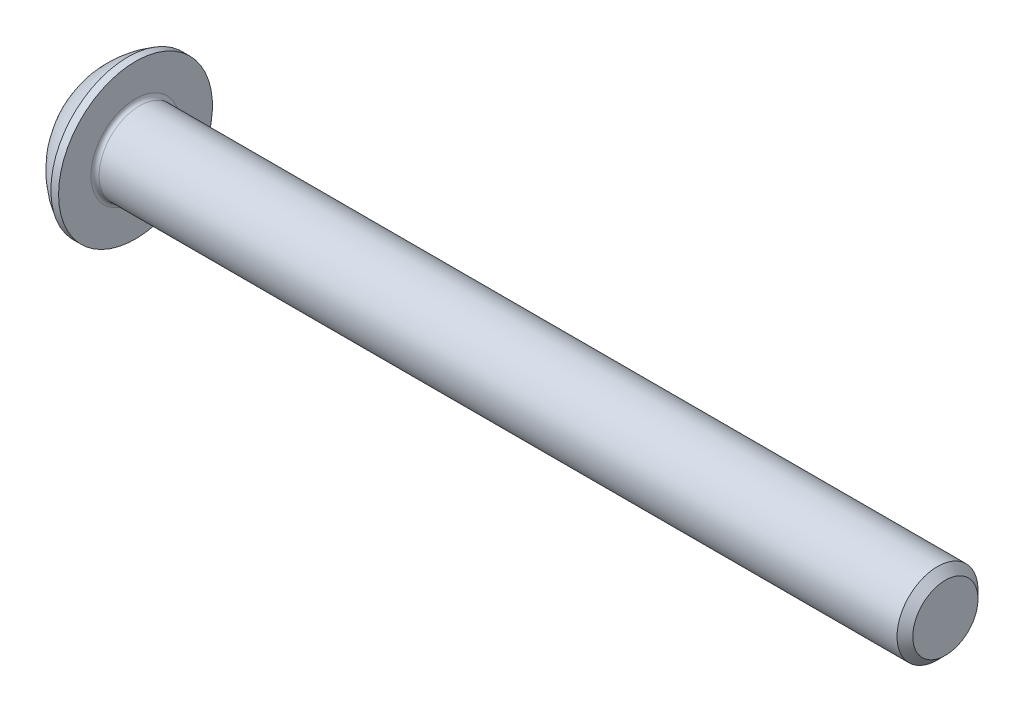
ISO-10303-21;
HEADER;
FILE_DESCRIPTION(('STEP AP214'),'2;1');
FILE_NAME('part.step','',(''),(''),'','','');
FILE_SCHEMA(('AUTOMOTIVE_DESIGN { 1 0 10303 214 1 1 1 1 }'));
ENDSEC;
DATA;
#1=APPLICATION_CONTEXT('core data for automotive mechanical design processes');
#2=APPLICATION_PROTOCOL_DEFINITION('international standard','automotive_design',2000,#1);
#3=PRODUCT_CONTEXT('',#1,'mechanical');
#4=PRODUCT('Part','Part','',(#3));
#5=PRODUCT_RELATED_PRODUCT_CATEGORY('part','',(#4));
#6=PRODUCT_DEFINITION_FORMATION('','',#4);
#7=PRODUCT_DEFINITION_CONTEXT('part definition',#1,'design');
#8=PRODUCT_DEFINITION('design','',#6,#7);
#9=PRODUCT_DEFINITION_SHAPE('','',#8);
#10=(LENGTH_UNIT() NAMED_UNIT(*) SI_UNIT(.MILLI.,.METRE.));
#11=(NAMED_UNIT(*) PLANE_ANGLE_UNIT() SI_UNIT($,.RADIAN.));
#12=(NAMED_UNIT(*) SI_UNIT($,.STERADIAN.) SOLID_ANGLE_UNIT());
#13=UNCERTAINTY_MEASURE_WITH_UNIT(LENGTH_MEASURE(1.E-05),#10,'distance_accuracy_value','');
#14=(GEOMETRIC_REPRESENTATION_CONTEXT(3) GLOBAL_UNCERTAINTY_ASSIGNED_CONTEXT((#13)) GLOBAL_UNIT_ASSIGNED_CONTEXT((#10,
#11,#12)) REPRESENTATION_CONTEXT('',''));
#15=CARTESIAN_POINT('',(0.,0.,0.));
#16=DIRECTION('',(0.,0.,1.));
#17=DIRECTION('',(1.,0.,0.));
#18=AXIS2_PLACEMENT_3D('',#15,#16,#17);
#19=CARTESIAN_POINT('',(0.,0.,0.));
#20=DIRECTION('',(-1.,0.,0.));
#21=DIRECTION('',(0.,0.,1.));
#22=AXIS2_PLACEMENT_3D('',#19,#20,#21);
#23=PLANE('',#22);
#24=CARTESIAN_POINT('',(0.,0.,0.));
#25=DIRECTION('',(-1.,0.,0.));
#26=DIRECTION('',(0.,0.,1.));
#27=AXIS2_PLACEMENT_3D('',#24,#25,#26);
#28=CIRCLE('',#27,1.9);
#29=CARTESIAN_POINT('',(0.,1.9,0.));
#30=VERTEX_POINT('',#29);
#31=EDGE_CURVE('E153',#30,#30,#28,.T.);
#32=ORIENTED_EDGE('',*,*,#31,.T.);
#33=EDGE_LOOP('',(#32));
#34=FACE_BOUND('',#33,.T.);
#35=DIRECTION('',(0.,-1.,0.));
#36=VECTOR('',#35,1.);
#37=CARTESIAN_POINT('',(0.,-0.721687836487031,1.25));
#38=LINE('',#37,#36);
#39=CARTESIAN_POINT('',(0.,0.721687836487033,1.25));
#40=VERTEX_POINT('',#39);
#41=CARTESIAN_POINT('',(0.,-0.721687836487031,1.25));
#42=VERTEX_POINT('',#41);
#43=EDGE_CURVE('E48',#40,#42,#38,.T.);
#44=ORIENTED_EDGE('',*,*,#43,.T.);
#45=DIRECTION('',(0.,-0.5,-0.866025403784438));
#46=VECTOR('',#45,1.);
#47=CARTESIAN_POINT('',(0.,-1.44337567297406,0.));
#48=LINE('',#47,#46);
#49=CARTESIAN_POINT('',(0.,-1.44337567297406,0.));
#50=VERTEX_POINT('',#49);
#51=EDGE_CURVE('E273',#42,#50,#48,.T.);
#52=ORIENTED_EDGE('',*,*,#51,.T.);
#53=DIRECTION('',(0.,0.5,-0.866025403784438));
#54=VECTOR('',#53,1.);
#55=CARTESIAN_POINT('',(0.,-0.721687836487032,-1.25));
#56=LINE('',#55,#54);
#57=CARTESIAN_POINT('',(0.,-0.721687836487032,-1.25));
#58=VERTEX_POINT('',#57);
#59=EDGE_CURVE('E128',#50,#58,#56,.T.);
#60=ORIENTED_EDGE('',*,*,#59,.T.);
#61=DIRECTION('',(0.,1.,0.));
#62=VECTOR('',#61,1.);
#63=CARTESIAN_POINT('',(0.,0.721687836487033,-1.25));
#64=LINE('',#63,#62);
#65=CARTESIAN_POINT('',(0.,0.721687836487033,-1.25));
#66=VERTEX_POINT('',#65);
#67=EDGE_CURVE('E276',#58,#66,#64,.T.);
#68=ORIENTED_EDGE('',*,*,#67,.T.);
#69=DIRECTION('',(0.,0.5,0.866025403784439));
#70=VECTOR('',#69,1.);
#71=CARTESIAN_POINT('',(0.,1.44337567297406,0.));
#72=LINE('',#71,#70);
#73=CARTESIAN_POINT('',(0.,1.44337567297406,0.));
#74=VERTEX_POINT('',#73);
#75=EDGE_CURVE('E278',#66,#74,#72,.T.);
#76=ORIENTED_EDGE('',*,*,#75,.T.);
#77=DIRECTION('',(0.,-0.5,0.866025403784439));
#78=VECTOR('',#77,1.);
#79=CARTESIAN_POINT('',(0.,0.721687836487033,1.25));
#80=LINE('',#79,#78);
#81=EDGE_CURVE('E280',#74,#40,#80,.T.);
#82=ORIENTED_EDGE('',*,*,#81,.T.);
#83=EDGE_LOOP('',(#44,#52,#60,#68,#76,#82));
#84=FACE_BOUND('',#83,.T.);
#85=ADVANCED_FACE('F33',(#34,#84),#23,.T.);
#86=CARTESIAN_POINT('',(3.88527472527473,0.,0.));
#87=DIRECTION('',(-1.,0.,0.));
#88=DIRECTION('',(0.,1.,0.));
#89=AXIS2_PLACEMENT_3D('',#86,#87,#88);
#90=SPHERICAL_SURFACE('',#89,4.3249693283142);
#91=CARTESIAN_POINT('',(1.82,0.,0.));
#92=DIRECTION('',(-1.,0.,0.));
#93=DIRECTION('',(0.,0.,1.));
#94=AXIS2_PLACEMENT_3D('',#91,#92,#93);
#95=CIRCLE('',#94,3.8);
#96=CARTESIAN_POINT('',(1.82,3.8,0.));
#97=VERTEX_POINT('',#96);
#98=EDGE_CURVE('E150',#97,#97,#95,.T.);
#99=CARTESIAN_POINT('',(1.82,3.8,0.));
#100=CARTESIAN_POINT('',(1.79553223778235,3.78670197498787,0.));
#101=CARTESIAN_POINT('',(1.77119294730718,3.77316757105695,0.));
#102=CARTESIAN_POINT('',(1.72278031308152,3.74563119292022,0.));
#103=CARTESIAN_POINT('',(1.69870696933103,3.73162921871441,0.));
#104=CARTESIAN_POINT('',(1.65083523179446,3.7031628875906,0.));
#105=CARTESIAN_POINT('',(1.62703683800837,3.6886985306726,0.));
#106=CARTESIAN_POINT('',(1.57972387446203,3.65931284095831,0.));
#107=CARTESIAN_POINT('',(1.55620930470177,3.64439150816201,0.));
#108=CARTESIAN_POINT('',(1.50947276449225,3.61409743150663,0.));
#109=CARTESIAN_POINT('',(1.48625079404298,3.59872468764754,0.));
#110=CARTESIAN_POINT('',(1.44010811665664,3.56753352546924,0.));
#111=CARTESIAN_POINT('',(1.41718740971957,3.55171510715004,0.));
#112=CARTESIAN_POINT('',(1.37165581166264,3.51963849804541,0.));
#113=CARTESIAN_POINT('',(1.34904492054277,3.50338030725998,0.));
#114=CARTESIAN_POINT('',(1.30414139068938,3.47043021954608,0.));
#115=CARTESIAN_POINT('',(1.28184875195586,3.45373832261761,0.));
#116=CARTESIAN_POINT('',(1.23759004473439,3.41992705070111,0.));
#117=CARTESIAN_POINT('',(1.21562397624644,3.40280767571308,0.));
#118=CARTESIAN_POINT('',(1.17202660551528,3.3681478352793,0.));
#119=CARTESIAN_POINT('',(1.15039530327208,3.35060736983354,0.));
#120=CARTESIAN_POINT('',(1.10747553612391,3.31511189319918,0.));
#121=CARTESIAN_POINT('',(1.08618707121895,3.29715688201057,0.));
#122=CARTESIAN_POINT('',(1.04396092192025,3.26083901328234,0.));
#123=CARTESIAN_POINT('',(1.02302323752651,3.24247615574272,0.));
#124=CARTESIAN_POINT('',(0.981506461539865,3.20534944588,0.));
#125=CARTESIAN_POINT('',(0.960927369946952,3.18658559355691,0.));
#126=CARTESIAN_POINT('',(0.920135458052999,3.14866389531445,0.));
#127=CARTESIAN_POINT('',(0.899922637751959,3.12950604939509,0.));
#128=CARTESIAN_POINT('',(0.859870810269304,3.09080351215454,0.));
#129=CARTESIAN_POINT('',(0.840031803087689,3.07125882083336,0.));
#130=CARTESIAN_POINT('',(0.800735004193913,3.0317898853238,0.));
#131=CARTESIAN_POINT('',(0.781277212481752,3.01186564113541,0.));
#132=CARTESIAN_POINT('',(0.74275010463742,2.97164503404517,0.));
#133=CARTESIAN_POINT('',(0.723680788505248,2.95134867114332,0.));
#134=CARTESIAN_POINT('',(0.685937746983035,2.91039139962521,0.));
#135=CARTESIAN_POINT('',(0.667264021592993,2.88973049100894,0.));
#136=CARTESIAN_POINT('',(0.630319129113973,2.84805183708071,0.));
#137=CARTESIAN_POINT('',(0.612047962024995,2.82703409176873,0.));
#138=CARTESIAN_POINT('',(0.575915003504076,2.78464960661105,0.));
#139=CARTESIAN_POINT('',(0.558053212072135,2.76328286676534,0.));
#140=CARTESIAN_POINT('',(0.522745669474638,2.72020836491933,0.));
#141=CARTESIAN_POINT('',(0.505299918309082,2.69850060291903,0.));
#142=CARTESIAN_POINT('',(0.470830965620254,2.65475215638556,0.));
#143=CARTESIAN_POINT('',(0.453807764096982,2.63271147185239,0.));
#144=CARTESIAN_POINT('',(0.420190262406822,2.58830540409509,0.));
#145=CARTESIAN_POINT('',(0.403595962239933,2.56594002087097,0.));
#146=CARTESIAN_POINT('',(0.370842454943266,2.52089290072626,0.));
#147=CARTESIAN_POINT('',(0.354683247813488,2.49821116380567,0.));
#148=CARTESIAN_POINT('',(0.322805955934171,2.45253979929826,0.));
#149=CARTESIAN_POINT('',(0.307087871184631,2.42955017171145,0.));
#150=CARTESIAN_POINT('',(0.27609868879919,2.38327160379141,0.));
#151=CARTESIAN_POINT('',(0.260827591163289,2.35998266345817,0.));
#152=CARTESIAN_POINT('',(0.230738081024335,2.31311415961106,0.));
#153=CARTESIAN_POINT('',(0.215919668521283,2.28953459609717,0.));
#154=CARTESIAN_POINT('',(0.186741057514276,2.24209364401867,0.));
#155=CARTESIAN_POINT('',(0.172380859010321,2.21823225545407,0.));
#156=CARTESIAN_POINT('',(0.144124034818958,2.17023655608655,0.));
#157=CARTESIAN_POINT('',(0.130227409131549,2.14610224528364,0.));
#158=CARTESIAN_POINT('',(0.102902912986767,2.09756970784785,0.));
#159=CARTESIAN_POINT('',(0.0894750425293921,2.07317148121498,0.));
#160=CARTESIAN_POINT('',(0.0630930771761369,2.02412021042083,0.));
#161=CARTESIAN_POINT('',(0.0501389822802563,1.99946716625955,0.));
#162=CARTESIAN_POINT('',(0.0247093637594986,1.94991547834234,0.));
#163=CARTESIAN_POINT('',(0.0122338401346214,1.9250168345864,0.));
#164=CARTESIAN_POINT('',(0.,1.9,0.));
#165=B_SPLINE_CURVE_WITH_KNOTS('',3,(#99,#100,#101,#102,#103,#104,#105,#106,#107,#108,#109,#110,
#111,#112,#113,#114,#115,#116,#117,#118,#119,#120,#121,#122,#123,#124,#125,#126,#127,#128,#129,
#130,#131,#132,#133,#134,#135,#136,#137,#138,#139,#140,#141,#142,#143,#144,#145,#146,#147,#148,
#149,#150,#151,#152,#153,#154,#155,#156,#157,#158,#159,#160,#161,#162,#163,#164),.UNSPECIFIED.,
.F.,.F.,(4,2,2,2,2,2,2,2,2,2,2,2,2,2,2,2,2,2,2,2,2,2,2,2,2,2,2,2,2,2,2,2,4),(0.,
0.083542578086179,0.167085156172358,0.250627734258538,0.334170312344717,0.417712890430896,
0.501255468517075,0.584798046603254,0.668340624689434,0.751883202775613,0.835425780861792,
0.918968358947971,1.00251093703415,1.08605351512033,1.16959609320651,1.25313867129269,
1.33668124937887,1.42022382746505,1.50376640555123,1.5873089836374,1.67085156172358,
1.75439413980976,1.83793671789594,1.92147929598212,2.0050218740683,2.08856445215448,
2.17210703024066,2.25564960832684,2.33919218641302,2.4227347644992,2.50627734258538,
2.58981992067156,2.67336249875773),.UNSPECIFIED.);
#166=EDGE_CURVE('BSEAM174',#97,#30,#165,.T.);
#167=ORIENTED_EDGE('',*,*,#98,.T.);
#168=ORIENTED_EDGE('',*,*,#31,.F.);
#169=ORIENTED_EDGE('',*,*,#166,.T.);
#170=ORIENTED_EDGE('',*,*,#166,.F.);
#171=EDGE_LOOP('',(#167,#169,#168,#170));
#172=FACE_BOUND('',#171,.T.);
#173=ADVANCED_FACE('F174',(#172),#90,.T.);
#174=CARTESIAN_POINT('',(0.,0.,0.));
#175=DIRECTION('',(-1.,0.,0.));
#176=DIRECTION('',(0.,0.,1.));
#177=AXIS2_PLACEMENT_3D('',#174,#175,#176);
#178=CYLINDRICAL_SURFACE('',#177,3.8);
#179=ORIENTED_EDGE('',*,*,#98,.F.);
#180=EDGE_LOOP('',(#179));
#181=FACE_BOUND('',#180,.T.);
#182=CARTESIAN_POINT('',(2.2,0.,0.));
#183=DIRECTION('',(-1.,0.,0.));
#184=DIRECTION('',(0.,0.,1.));
#185=AXIS2_PLACEMENT_3D('',#182,#183,#184);
#186=CIRCLE('',#185,3.8);
#187=CARTESIAN_POINT('',(2.2,0.,3.8));
#188=VERTEX_POINT('',#187);
#189=EDGE_CURVE('E147',#188,#188,#186,.T.);
#190=ORIENTED_EDGE('',*,*,#189,.T.);
#191=EDGE_LOOP('',(#190));
#192=FACE_BOUND('',#191,.T.);
#193=ADVANCED_FACE('F179',(#181,#192),#178,.T.);
#194=CARTESIAN_POINT('',(2.2,2.,0.));
#195=DIRECTION('',(-1.,0.,0.));
#196=DIRECTION('',(0.,0.,1.));
#197=AXIS2_PLACEMENT_3D('',#194,#195,#196);
#198=PLANE('',#197);
#199=CARTESIAN_POINT('',(2.2,0.,0.));
#200=DIRECTION('',(-1.,0.,0.));
#201=DIRECTION('',(0.,0.,1.));
#202=AXIS2_PLACEMENT_3D('',#199,#200,#201);
#203=CIRCLE('',#202,2.2);
#204=CARTESIAN_POINT('',(2.2,0.,2.2));
#205=VERTEX_POINT('',#204);
#206=EDGE_CURVE('E41',#205,#205,#203,.T.);
#207=ORIENTED_EDGE('',*,*,#206,.T.);
#208=EDGE_LOOP('',(#207));
#209=FACE_BOUND('',#208,.T.);
#210=ORIENTED_EDGE('',*,*,#189,.F.);
#211=EDGE_LOOP('',(#210));
#212=FACE_BOUND('',#211,.T.);
#213=ADVANCED_FACE('F158',(#209,#212),#198,.F.);
#214=CARTESIAN_POINT('',(0.,0.,0.));
#215=DIRECTION('',(-1.,0.,0.));
#216=DIRECTION('',(0.,0.,1.));
#217=AXIS2_PLACEMENT_3D('',#214,#215,#216);
#218=CYLINDRICAL_SURFACE('',#217,2.);
#219=CARTESIAN_POINT('',(2.4,0.,0.));
#220=DIRECTION('',(-1.,0.,0.));
#221=DIRECTION('',(0.,0.,1.));
#222=AXIS2_PLACEMENT_3D('',#219,#220,#221);
#223=CIRCLE('',#222,2.);
#224=CARTESIAN_POINT('',(2.4,0.,2.));
#225=VERTEX_POINT('',#224);
#226=EDGE_CURVE('E11',#225,#225,#223,.F.);
#227=ORIENTED_EDGE('',*,*,#226,.T.);
#228=EDGE_LOOP('',(#227));
#229=FACE_BOUND('',#228,.T.);
#230=CARTESIAN_POINT('',(41.81,0.,0.));
#231=DIRECTION('',(-1.,0.,0.));
#232=DIRECTION('',(0.,0.,1.));
#233=AXIS2_PLACEMENT_3D('',#230,#231,#232);
#234=CIRCLE('',#233,2.);
#235=CARTESIAN_POINT('',(41.81,0.,2.));
#236=VERTEX_POINT('',#235);
#237=EDGE_CURVE('E144',#236,#236,#234,.T.);
#238=ORIENTED_EDGE('',*,*,#237,.T.);
#239=EDGE_LOOP('',(#238));
#240=FACE_BOUND('',#239,.T.);
#241=ADVANCED_FACE('F188',(#229,#240),#218,.T.);
#242=CARTESIAN_POINT('',(42.2,0.,0.));
#243=DIRECTION('',(-1.,0.,0.));
#244=DIRECTION('',(0.,0.,1.));
#245=AXIS2_PLACEMENT_3D('',#242,#243,#244);
#246=CONICAL_SURFACE('',#245,1.61,0.785398163397433);
#247=ORIENTED_EDGE('',*,*,#237,.F.);
#248=EDGE_LOOP('',(#247));
#249=FACE_BOUND('',#248,.T.);
#250=CARTESIAN_POINT('',(42.2,0.,0.));
#251=DIRECTION('',(-1.,0.,0.));
#252=DIRECTION('',(0.,0.,1.));
#253=AXIS2_PLACEMENT_3D('',#250,#251,#252);
#254=CIRCLE('',#253,1.61);
#255=CARTESIAN_POINT('',(42.2,0.,1.61));
#256=VERTEX_POINT('',#255);
#257=EDGE_CURVE('E140',#256,#256,#254,.T.);
#258=ORIENTED_EDGE('',*,*,#257,.T.);
#259=EDGE_LOOP('',(#258));
#260=FACE_BOUND('',#259,.T.);
#261=ADVANCED_FACE('F169',(#249,#260),#246,.T.);
#262=CARTESIAN_POINT('',(42.2,0.,0.));
#263=DIRECTION('',(-1.,0.,0.));
#264=DIRECTION('',(0.,0.,1.));
#265=AXIS2_PLACEMENT_3D('',#262,#263,#264);
#266=PLANE('',#265);
#267=ORIENTED_EDGE('',*,*,#257,.F.);
#268=EDGE_LOOP('',(#267));
#269=FACE_BOUND('',#268,.T.);
#270=ADVANCED_FACE('F162',(#269),#266,.F.);
#271=CARTESIAN_POINT('',(2.4,0.,0.));
#272=DIRECTION('',(-1.,0.,0.));
#273=DIRECTION('',(0.,0.,1.));
#274=AXIS2_PLACEMENT_3D('',#271,#272,#273);
#275=TOROIDAL_SURFACE('',#274,2.2,0.2);
#276=ORIENTED_EDGE('',*,*,#226,.F.);
#277=EDGE_LOOP('',(#276));
#278=FACE_BOUND('',#277,.T.);
#279=ORIENTED_EDGE('',*,*,#206,.F.);
#280=EDGE_LOOP('',(#279));
#281=FACE_BOUND('',#280,.T.);
#282=ADVANCED_FACE('F35',(#278,#281),#275,.F.);
#283=CARTESIAN_POINT('',(1.3,-1.44337567297406,0.));
#284=DIRECTION('',(0.,0.866025403784438,-0.5));
#285=DIRECTION('',(0.,0.5,0.866025403784438));
#286=AXIS2_PLACEMENT_3D('',#283,#284,#285);
#287=PLANE('',#286);
#288=DIRECTION('',(0.,-0.5,-0.866025403784438));
#289=VECTOR('',#288,1.);
#290=CARTESIAN_POINT('',(1.3,-1.44337567297406,0.));
#291=LINE('',#290,#289);
#292=CARTESIAN_POINT('',(1.3,-0.721687836487031,1.25));
#293=VERTEX_POINT('',#292);
#294=CARTESIAN_POINT('',(1.3,-1.08253175473055,0.625));
#295=VERTEX_POINT('',#294);
#296=EDGE_CURVE('E114',#293,#295,#291,.T.);
#297=ORIENTED_EDGE('',*,*,#296,.T.);
#298=CARTESIAN_POINT('',(1.3,-1.44337567297406,0.));
#299=VERTEX_POINT('',#298);
#300=EDGE_CURVE('E109',#295,#299,#291,.T.);
#301=ORIENTED_EDGE('',*,*,#300,.T.);
#302=DIRECTION('',(-1.,0.,0.));
#303=VECTOR('',#302,1.);
#304=CARTESIAN_POINT('',(1.3,-1.44337567297406,0.));
#305=LINE('',#304,#303);
#306=EDGE_CURVE('E111',#299,#50,#305,.T.);
#307=ORIENTED_EDGE('',*,*,#306,.T.);
#308=ORIENTED_EDGE('',*,*,#51,.F.);
#309=DIRECTION('',(-1.,0.,0.));
#310=VECTOR('',#309,1.);
#311=CARTESIAN_POINT('',(1.3,-0.721687836487031,1.25));
#312=LINE('',#311,#310);
#313=EDGE_CURVE('E269',#293,#42,#312,.T.);
#314=ORIENTED_EDGE('',*,*,#313,.F.);
#315=EDGE_LOOP('',(#297,#301,#307,#308,#314));
#316=FACE_BOUND('',#315,.T.);
#317=ADVANCED_FACE('F110',(#316),#287,.T.);
#318=CARTESIAN_POINT('',(1.3,-0.721687836487032,-1.25));
#319=DIRECTION('',(0.,0.866025403784438,0.5));
#320=DIRECTION('',(0.,-0.5,0.866025403784439));
#321=AXIS2_PLACEMENT_3D('',#318,#319,#320);
#322=PLANE('',#321);
#323=DIRECTION('',(0.,0.5,-0.866025403784438));
#324=VECTOR('',#323,1.);
#325=CARTESIAN_POINT('',(1.3,-0.721687836487032,-1.25));
#326=LINE('',#325,#324);
#327=CARTESIAN_POINT('',(1.3,-1.08253175473055,-0.625000000000001));
#328=VERTEX_POINT('',#327);
#329=EDGE_CURVE('E56',#299,#328,#326,.T.);
#330=ORIENTED_EDGE('',*,*,#329,.T.);
#331=CARTESIAN_POINT('',(1.3,-0.721687836487032,-1.25));
#332=VERTEX_POINT('',#331);
#333=EDGE_CURVE('E123',#328,#332,#326,.T.);
#334=ORIENTED_EDGE('',*,*,#333,.T.);
#335=DIRECTION('',(-1.,0.,0.));
#336=VECTOR('',#335,1.);
#337=CARTESIAN_POINT('',(1.3,-0.721687836487032,-1.25));
#338=LINE('',#337,#336);
#339=EDGE_CURVE('E130',#332,#58,#338,.T.);
#340=ORIENTED_EDGE('',*,*,#339,.T.);
#341=ORIENTED_EDGE('',*,*,#59,.F.);
#342=ORIENTED_EDGE('',*,*,#306,.F.);
#343=EDGE_LOOP('',(#330,#334,#340,#341,#342));
#344=FACE_BOUND('',#343,.T.);
#345=ADVANCED_FACE('F126',(#344),#322,.T.);
#346=CARTESIAN_POINT('',(1.3,0.721687836487033,-1.25));
#347=DIRECTION('',(0.,0.,1.));
#348=DIRECTION('',(1.,0.,0.));
#349=AXIS2_PLACEMENT_3D('',#346,#347,#348);
#350=PLANE('',#349);
#351=DIRECTION('',(0.,1.,0.));
#352=VECTOR('',#351,1.);
#353=CARTESIAN_POINT('',(1.3,0.721687836487033,-1.25));
#354=LINE('',#353,#352);
#355=CARTESIAN_POINT('',(1.3,0.,-1.25));
#356=VERTEX_POINT('',#355);
#357=EDGE_CURVE('E250',#332,#356,#354,.T.);
#358=ORIENTED_EDGE('',*,*,#357,.T.);
#359=CARTESIAN_POINT('',(1.3,0.721687836487033,-1.25));
#360=VERTEX_POINT('',#359);
#361=EDGE_CURVE('E122',#356,#360,#354,.T.);
#362=ORIENTED_EDGE('',*,*,#361,.T.);
#363=DIRECTION('',(-1.,0.,0.));
#364=VECTOR('',#363,1.);
#365=CARTESIAN_POINT('',(1.3,0.721687836487033,-1.25));
#366=LINE('',#365,#364);
#367=EDGE_CURVE('E135',#360,#66,#366,.T.);
#368=ORIENTED_EDGE('',*,*,#367,.T.);
#369=ORIENTED_EDGE('',*,*,#67,.F.);
#370=ORIENTED_EDGE('',*,*,#339,.F.);
#371=EDGE_LOOP('',(#358,#362,#368,#369,#370));
#372=FACE_BOUND('',#371,.T.);
#373=ADVANCED_FACE('F202',(#372),#350,.T.);
#374=CARTESIAN_POINT('',(1.3,1.44337567297406,0.));
#375=DIRECTION('',(0.,-0.866025403784439,0.5));
#376=DIRECTION('',(0.,-0.5,-0.866025403784439));
#377=AXIS2_PLACEMENT_3D('',#374,#375,#376);
#378=PLANE('',#377);
#379=DIRECTION('',(0.,0.5,0.866025403784439));
#380=VECTOR('',#379,1.);
#381=CARTESIAN_POINT('',(1.3,1.44337567297406,0.));
#382=LINE('',#381,#380);
#383=CARTESIAN_POINT('',(1.3,1.08253175473055,-0.625));
#384=VERTEX_POINT('',#383);
#385=EDGE_CURVE('E239',#360,#384,#382,.T.);
#386=ORIENTED_EDGE('',*,*,#385,.T.);
#387=CARTESIAN_POINT('',(1.3,1.44337567297406,0.));
#388=VERTEX_POINT('',#387);
#389=EDGE_CURVE('E244',#384,#388,#382,.T.);
#390=ORIENTED_EDGE('',*,*,#389,.T.);
#391=DIRECTION('',(-1.,0.,0.));
#392=VECTOR('',#391,1.);
#393=CARTESIAN_POINT('',(1.3,1.44337567297406,0.));
#394=LINE('',#393,#392);
#395=EDGE_CURVE('E284',#388,#74,#394,.T.);
#396=ORIENTED_EDGE('',*,*,#395,.T.);
#397=ORIENTED_EDGE('',*,*,#75,.F.);
#398=ORIENTED_EDGE('',*,*,#367,.F.);
#399=EDGE_LOOP('',(#386,#390,#396,#397,#398));
#400=FACE_BOUND('',#399,.T.);
#401=ADVANCED_FACE('F205',(#400),#378,.T.);
#402=CARTESIAN_POINT('',(1.3,0.721687836487033,1.25));
#403=DIRECTION('',(0.,-0.866025403784439,-0.5));
#404=DIRECTION('',(0.,0.5,-0.866025403784439));
#405=AXIS2_PLACEMENT_3D('',#402,#403,#404);
#406=PLANE('',#405);
#407=DIRECTION('',(0.,-0.5,0.866025403784439));
#408=VECTOR('',#407,1.);
#409=CARTESIAN_POINT('',(1.3,0.721687836487033,1.25));
#410=LINE('',#409,#408);
#411=CARTESIAN_POINT('',(1.3,1.08253175473055,0.625));
#412=VERTEX_POINT('',#411);
#413=EDGE_CURVE('E247',#388,#412,#410,.T.);
#414=ORIENTED_EDGE('',*,*,#413,.T.);
#415=CARTESIAN_POINT('',(1.3,0.721687836487033,1.25));
#416=VERTEX_POINT('',#415);
#417=EDGE_CURVE('E255',#412,#416,#410,.T.);
#418=ORIENTED_EDGE('',*,*,#417,.T.);
#419=DIRECTION('',(-1.,0.,0.));
#420=VECTOR('',#419,1.);
#421=CARTESIAN_POINT('',(1.3,0.721687836487033,1.25));
#422=LINE('',#421,#420);
#423=EDGE_CURVE('E268',#416,#40,#422,.T.);
#424=ORIENTED_EDGE('',*,*,#423,.T.);
#425=ORIENTED_EDGE('',*,*,#81,.F.);
#426=ORIENTED_EDGE('',*,*,#395,.F.);
#427=EDGE_LOOP('',(#414,#418,#424,#425,#426));
#428=FACE_BOUND('',#427,.T.);
#429=ADVANCED_FACE('F209',(#428),#406,.T.);
#430=CARTESIAN_POINT('',(1.3,-0.721687836487031,1.25));
#431=DIRECTION('',(0.,0.,-1.));
#432=DIRECTION('',(0.,1.,0.));
#433=AXIS2_PLACEMENT_3D('',#430,#431,#432);
#434=PLANE('',#433);
#435=DIRECTION('',(0.,-1.,0.));
#436=VECTOR('',#435,1.);
#437=CARTESIAN_POINT('',(1.3,-0.721687836487031,1.25));
#438=LINE('',#437,#436);
#439=CARTESIAN_POINT('',(1.3,0.,1.25));
#440=VERTEX_POINT('',#439);
#441=EDGE_CURVE('E261',#416,#440,#438,.T.);
#442=ORIENTED_EDGE('',*,*,#441,.T.);
#443=EDGE_CURVE('E263',#440,#293,#438,.T.);
#444=ORIENTED_EDGE('',*,*,#443,.T.);
#445=ORIENTED_EDGE('',*,*,#313,.T.);
#446=ORIENTED_EDGE('',*,*,#43,.F.);
#447=ORIENTED_EDGE('',*,*,#423,.F.);
#448=EDGE_LOOP('',(#442,#444,#445,#446,#447));
#449=FACE_BOUND('',#448,.T.);
#450=ADVANCED_FACE('F213',(#449),#434,.T.);
#451=CARTESIAN_POINT('',(1.3,-1.44337567297406,0.));
#452=DIRECTION('',(1.,0.,0.));
#453=DIRECTION('',(0.,0.,-1.));
#454=AXIS2_PLACEMENT_3D('',#451,#452,#453);
#455=PLANE('',#454);
#456=CARTESIAN_POINT('',(1.3,0.,0.));
#457=DIRECTION('',(-1.,0.,0.));
#458=DIRECTION('',(0.,0.,1.));
#459=AXIS2_PLACEMENT_3D('',#456,#457,#458);
#460=CIRCLE('',#459,1.25);
#461=EDGE_CURVE('E236',#384,#356,#460,.T.);
#462=ORIENTED_EDGE('',*,*,#461,.F.);
#463=ORIENTED_EDGE('',*,*,#385,.F.);
#464=ORIENTED_EDGE('',*,*,#361,.F.);
#465=EDGE_LOOP('',(#462,#463,#464));
#466=FACE_BOUND('',#465,.T.);
#467=ADVANCED_FACE('F217',(#466),#455,.F.);
#468=EDGE_CURVE('E141',#412,#384,#460,.T.);
#469=ORIENTED_EDGE('',*,*,#468,.F.);
#470=ORIENTED_EDGE('',*,*,#413,.F.);
#471=ORIENTED_EDGE('',*,*,#389,.F.);
#472=EDGE_LOOP('',(#469,#470,#471));
#473=FACE_BOUND('',#472,.T.);
#474=ADVANCED_FACE('F226',(#473),#455,.F.);
#475=EDGE_CURVE('E134',#440,#412,#460,.T.);
#476=ORIENTED_EDGE('',*,*,#475,.F.);
#477=ORIENTED_EDGE('',*,*,#441,.F.);
#478=ORIENTED_EDGE('',*,*,#417,.F.);
#479=EDGE_LOOP('',(#476,#477,#478));
#480=FACE_BOUND('',#479,.T.);
#481=ADVANCED_FACE('F231',(#480),#455,.F.);
#482=EDGE_CURVE('E129',#295,#440,#460,.T.);
#483=ORIENTED_EDGE('',*,*,#482,.F.);
#484=ORIENTED_EDGE('',*,*,#296,.F.);
#485=ORIENTED_EDGE('',*,*,#443,.F.);
#486=EDGE_LOOP('',(#483,#484,#485));
#487=FACE_BOUND('',#486,.T.);
#488=ADVANCED_FACE('F224',(#487),#455,.F.);
#489=EDGE_CURVE('E120',#328,#295,#460,.T.);
#490=ORIENTED_EDGE('',*,*,#489,.F.);
#491=ORIENTED_EDGE('',*,*,#329,.F.);
#492=ORIENTED_EDGE('',*,*,#300,.F.);
#493=EDGE_LOOP('',(#490,#491,#492));
#494=FACE_BOUND('',#493,.T.);
#495=ADVANCED_FACE('F119',(#494),#455,.F.);
#496=EDGE_CURVE('E242',#356,#328,#460,.T.);
#497=ORIENTED_EDGE('',*,*,#496,.F.);
#498=ORIENTED_EDGE('',*,*,#357,.F.);
#499=ORIENTED_EDGE('',*,*,#333,.F.);
#500=EDGE_LOOP('',(#497,#498,#499));
#501=FACE_BOUND('',#500,.T.);
#502=ADVANCED_FACE('F197',(#501),#455,.F.);
#503=CARTESIAN_POINT('',(2.02168783648704,0.,0.));
#504=DIRECTION('',(-1.,0.,0.));
#505=DIRECTION('',(0.,0.,1.));
#506=AXIS2_PLACEMENT_3D('',#503,#504,#505);
#507=CONICAL_SURFACE('',#506,0.,1.04719755119659);
#508=ORIENTED_EDGE('',*,*,#475,.T.);
#509=ORIENTED_EDGE('',*,*,#468,.T.);
#510=ORIENTED_EDGE('',*,*,#461,.T.);
#511=ORIENTED_EDGE('',*,*,#496,.T.);
#512=ORIENTED_EDGE('',*,*,#489,.T.);
#513=ORIENTED_EDGE('',*,*,#482,.T.);
#514=EDGE_LOOP('',(#508,#509,#510,#511,#512,#513));
#515=FACE_BOUND('',#514,.T.);
#516=CARTESIAN_POINT('',(2.02168783648704,0.,0.));
#517=VERTEX_POINT('',#516);
#518=VERTEX_LOOP('',#517);
#519=FACE_BOUND('',#518,.T.);
#520=ADVANCED_FACE('F195',(#515,#519),#507,.F.);
#521=CLOSED_SHELL('',(#85,#173,#193,#213,#241,#261,#270,#282,#317,#345,#373,#401,#429,#450,#467,
#474,#481,#488,#495,#502,#520));
#522=MANIFOLD_SOLID_BREP('B2',#521);
#523=ADVANCED_BREP_SHAPE_REPRESENTATION('',(#18,#522),#14);
#524=SHAPE_DEFINITION_REPRESENTATION(#9,#523);
ENDSEC;
END-ISO-10303-21;
